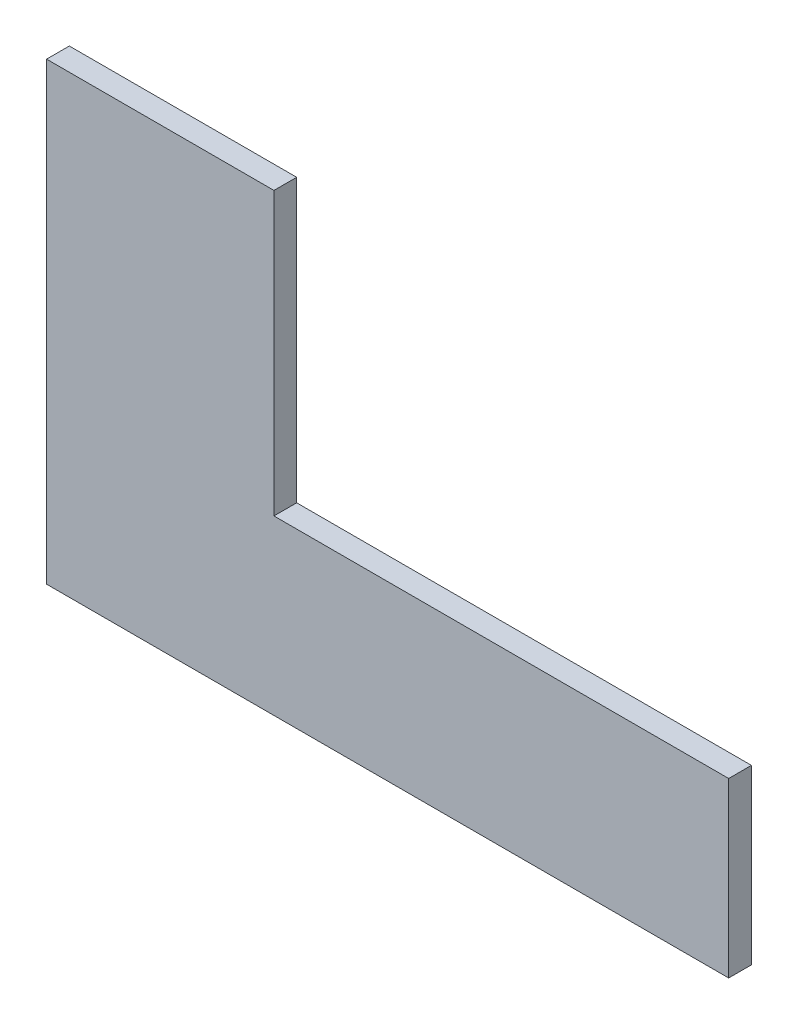
ISO-10303-21;
HEADER;
FILE_DESCRIPTION(('STEP AP214'),'2;1');
FILE_NAME('part.step','',(''),(''),'','','');
FILE_SCHEMA(('AUTOMOTIVE_DESIGN { 1 0 10303 214 1 1 1 1 }'));
ENDSEC;
DATA;
#1=APPLICATION_CONTEXT('core data for automotive mechanical design processes');
#2=APPLICATION_PROTOCOL_DEFINITION('international standard','automotive_design',2000,#1);
#3=PRODUCT_CONTEXT('',#1,'mechanical');
#4=PRODUCT('Part','Part','',(#3));
#5=PRODUCT_RELATED_PRODUCT_CATEGORY('part','',(#4));
#6=PRODUCT_DEFINITION_FORMATION('','',#4);
#7=PRODUCT_DEFINITION_CONTEXT('part definition',#1,'design');
#8=PRODUCT_DEFINITION('design','',#6,#7);
#9=PRODUCT_DEFINITION_SHAPE('','',#8);
#10=(LENGTH_UNIT() NAMED_UNIT(*) SI_UNIT(.MILLI.,.METRE.));
#11=(NAMED_UNIT(*) PLANE_ANGLE_UNIT() SI_UNIT($,.RADIAN.));
#12=(NAMED_UNIT(*) SI_UNIT($,.STERADIAN.) SOLID_ANGLE_UNIT());
#13=UNCERTAINTY_MEASURE_WITH_UNIT(LENGTH_MEASURE(1.E-05),#10,'distance_accuracy_value','');
#14=(GEOMETRIC_REPRESENTATION_CONTEXT(3) GLOBAL_UNCERTAINTY_ASSIGNED_CONTEXT((#13)) GLOBAL_UNIT_ASSIGNED_CONTEXT((#10,
#11,#12)) REPRESENTATION_CONTEXT('',''));
#15=CARTESIAN_POINT('',(0.,0.,0.));
#16=DIRECTION('',(0.,0.,1.));
#17=DIRECTION('',(1.,0.,0.));
#18=AXIS2_PLACEMENT_3D('',#15,#16,#17);
#19=CARTESIAN_POINT('',(-86.8933066390796,-49.5409866344727,5.));
#20=DIRECTION('',(1.,0.,0.));
#21=DIRECTION('',(0.,1.,0.));
#22=AXIS2_PLACEMENT_3D('',#19,#20,#21);
#23=PLANE('',#22);
#24=DIRECTION('',(0.,-1.,0.));
#25=VECTOR('',#24,1.);
#26=CARTESIAN_POINT('',(-86.8933066390796,-49.5409866344727,0.));
#27=LINE('',#26,#25);
#28=CARTESIAN_POINT('',(-86.8933066390796,50.4590133655273,0.));
#29=VERTEX_POINT('',#28);
#30=CARTESIAN_POINT('',(-86.8933066390796,-49.5409866344727,0.));
#31=VERTEX_POINT('',#30);
#32=EDGE_CURVE('E132',#29,#31,#27,.T.);
#33=ORIENTED_EDGE('',*,*,#32,.T.);
#34=DIRECTION('',(0.,0.,-1.));
#35=VECTOR('',#34,1.);
#36=CARTESIAN_POINT('',(-86.8933066390796,-49.5409866344727,5.));
#37=LINE('',#36,#35);
#38=CARTESIAN_POINT('',(-86.8933066390796,-49.5409866344727,5.));
#39=VERTEX_POINT('',#38);
#40=EDGE_CURVE('E11',#39,#31,#37,.T.);
#41=ORIENTED_EDGE('',*,*,#40,.F.);
#42=DIRECTION('',(0.,-1.,0.));
#43=VECTOR('',#42,1.);
#44=CARTESIAN_POINT('',(-86.8933066390796,-49.5409866344727,5.));
#45=LINE('',#44,#43);
#46=CARTESIAN_POINT('',(-86.8933066390796,50.4590133655273,5.));
#47=VERTEX_POINT('',#46);
#48=EDGE_CURVE('E148',#47,#39,#45,.T.);
#49=ORIENTED_EDGE('',*,*,#48,.F.);
#50=DIRECTION('',(0.,0.,-1.));
#51=VECTOR('',#50,1.);
#52=CARTESIAN_POINT('',(-86.8933066390796,50.4590133655273,5.));
#53=LINE('',#52,#51);
#54=EDGE_CURVE('E128',#47,#29,#53,.T.);
#55=ORIENTED_EDGE('',*,*,#54,.T.);
#56=EDGE_LOOP('',(#33,#41,#49,#55));
#57=FACE_BOUND('',#56,.T.);
#58=ADVANCED_FACE('F43',(#57),#23,.F.);
#59=CARTESIAN_POINT('',(63.1066933609204,-49.5409866344727,5.));
#60=DIRECTION('',(0.,1.,0.));
#61=DIRECTION('',(0.,0.,1.));
#62=AXIS2_PLACEMENT_3D('',#59,#60,#61);
#63=PLANE('',#62);
#64=DIRECTION('',(1.,0.,0.));
#65=VECTOR('',#64,1.);
#66=CARTESIAN_POINT('',(63.1066933609204,-49.5409866344727,0.));
#67=LINE('',#66,#65);
#68=CARTESIAN_POINT('',(63.1066933609204,-49.5409866344727,0.));
#69=VERTEX_POINT('',#68);
#70=EDGE_CURVE('E136',#31,#69,#67,.T.);
#71=ORIENTED_EDGE('',*,*,#70,.T.);
#72=DIRECTION('',(0.,0.,-1.));
#73=VECTOR('',#72,1.);
#74=CARTESIAN_POINT('',(63.1066933609204,-49.5409866344727,5.));
#75=LINE('',#74,#73);
#76=CARTESIAN_POINT('',(63.1066933609204,-49.5409866344727,5.));
#77=VERTEX_POINT('',#76);
#78=EDGE_CURVE('E52',#77,#69,#75,.T.);
#79=ORIENTED_EDGE('',*,*,#78,.F.);
#80=DIRECTION('',(1.,0.,0.));
#81=VECTOR('',#80,1.);
#82=CARTESIAN_POINT('',(63.1066933609204,-49.5409866344727,5.));
#83=LINE('',#82,#81);
#84=EDGE_CURVE('E97',#39,#77,#83,.T.);
#85=ORIENTED_EDGE('',*,*,#84,.F.);
#86=ORIENTED_EDGE('',*,*,#40,.T.);
#87=EDGE_LOOP('',(#71,#79,#85,#86));
#88=FACE_BOUND('',#87,.T.);
#89=ADVANCED_FACE('F176',(#88),#63,.F.);
#90=CARTESIAN_POINT('',(63.1066933609204,-11.5409866344727,5.));
#91=DIRECTION('',(-1.,0.,0.));
#92=DIRECTION('',(0.,0.,1.));
#93=AXIS2_PLACEMENT_3D('',#90,#91,#92);
#94=PLANE('',#93);
#95=DIRECTION('',(0.,1.,0.));
#96=VECTOR('',#95,1.);
#97=CARTESIAN_POINT('',(63.1066933609204,-11.5409866344727,0.));
#98=LINE('',#97,#96);
#99=CARTESIAN_POINT('',(63.1066933609204,-11.5409866344727,0.));
#100=VERTEX_POINT('',#99);
#101=EDGE_CURVE('E139',#69,#100,#98,.T.);
#102=ORIENTED_EDGE('',*,*,#101,.T.);
#103=DIRECTION('',(0.,0.,-1.));
#104=VECTOR('',#103,1.);
#105=CARTESIAN_POINT('',(63.1066933609204,-11.5409866344727,5.));
#106=LINE('',#105,#104);
#107=CARTESIAN_POINT('',(63.1066933609204,-11.5409866344727,5.));
#108=VERTEX_POINT('',#107);
#109=EDGE_CURVE('E121',#108,#100,#106,.T.);
#110=ORIENTED_EDGE('',*,*,#109,.F.);
#111=DIRECTION('',(0.,1.,0.));
#112=VECTOR('',#111,1.);
#113=CARTESIAN_POINT('',(63.1066933609204,-11.5409866344727,5.));
#114=LINE('',#113,#112);
#115=EDGE_CURVE('E110',#77,#108,#114,.T.);
#116=ORIENTED_EDGE('',*,*,#115,.F.);
#117=ORIENTED_EDGE('',*,*,#78,.T.);
#118=EDGE_LOOP('',(#102,#110,#116,#117));
#119=FACE_BOUND('',#118,.T.);
#120=ADVANCED_FACE('F158',(#119),#94,.F.);
#121=CARTESIAN_POINT('',(-36.8933066390796,-11.5409866344727,5.));
#122=DIRECTION('',(0.,-1.,0.));
#123=DIRECTION('',(0.,0.,-1.));
#124=AXIS2_PLACEMENT_3D('',#121,#122,#123);
#125=PLANE('',#124);
#126=DIRECTION('',(-1.,0.,0.));
#127=VECTOR('',#126,1.);
#128=CARTESIAN_POINT('',(-36.8933066390796,-11.5409866344727,0.));
#129=LINE('',#128,#127);
#130=CARTESIAN_POINT('',(-36.8933066390796,-11.5409866344727,0.));
#131=VERTEX_POINT('',#130);
#132=EDGE_CURVE('E119',#100,#131,#129,.T.);
#133=ORIENTED_EDGE('',*,*,#132,.T.);
#134=DIRECTION('',(0.,0.,-1.));
#135=VECTOR('',#134,1.);
#136=CARTESIAN_POINT('',(-36.8933066390796,-11.5409866344727,5.));
#137=LINE('',#136,#135);
#138=CARTESIAN_POINT('',(-36.8933066390796,-11.5409866344727,5.));
#139=VERTEX_POINT('',#138);
#140=EDGE_CURVE('E116',#139,#131,#137,.T.);
#141=ORIENTED_EDGE('',*,*,#140,.F.);
#142=DIRECTION('',(-1.,0.,0.));
#143=VECTOR('',#142,1.);
#144=CARTESIAN_POINT('',(-36.8933066390796,-11.5409866344727,5.));
#145=LINE('',#144,#143);
#146=EDGE_CURVE('E104',#108,#139,#145,.T.);
#147=ORIENTED_EDGE('',*,*,#146,.F.);
#148=ORIENTED_EDGE('',*,*,#109,.T.);
#149=EDGE_LOOP('',(#133,#141,#147,#148));
#150=FACE_BOUND('',#149,.T.);
#151=ADVANCED_FACE('F117',(#150),#125,.F.);
#152=CARTESIAN_POINT('',(-36.8933066390796,50.4590133655273,5.));
#153=DIRECTION('',(-1.,0.,0.));
#154=DIRECTION('',(0.,0.,1.));
#155=AXIS2_PLACEMENT_3D('',#152,#153,#154);
#156=PLANE('',#155);
#157=DIRECTION('',(0.,1.,0.));
#158=VECTOR('',#157,1.);
#159=CARTESIAN_POINT('',(-36.8933066390796,50.4590133655273,0.));
#160=LINE('',#159,#158);
#161=CARTESIAN_POINT('',(-36.8933066390796,50.4590133655273,0.));
#162=VERTEX_POINT('',#161);
#163=EDGE_CURVE('E83',#131,#162,#160,.T.);
#164=ORIENTED_EDGE('',*,*,#163,.T.);
#165=DIRECTION('',(0.,0.,-1.));
#166=VECTOR('',#165,1.);
#167=CARTESIAN_POINT('',(-36.8933066390796,50.4590133655273,5.));
#168=LINE('',#167,#166);
#169=CARTESIAN_POINT('',(-36.8933066390796,50.4590133655273,5.));
#170=VERTEX_POINT('',#169);
#171=EDGE_CURVE('E122',#170,#162,#168,.T.);
#172=ORIENTED_EDGE('',*,*,#171,.F.);
#173=DIRECTION('',(0.,1.,0.));
#174=VECTOR('',#173,1.);
#175=CARTESIAN_POINT('',(-36.8933066390796,50.4590133655273,5.));
#176=LINE('',#175,#174);
#177=EDGE_CURVE('E108',#139,#170,#176,.T.);
#178=ORIENTED_EDGE('',*,*,#177,.F.);
#179=ORIENTED_EDGE('',*,*,#140,.T.);
#180=EDGE_LOOP('',(#164,#172,#178,#179));
#181=FACE_BOUND('',#180,.T.);
#182=ADVANCED_FACE('F124',(#181),#156,.F.);
#183=CARTESIAN_POINT('',(-86.8933066390796,50.4590133655273,5.));
#184=DIRECTION('',(0.,-1.,0.));
#185=DIRECTION('',(1.,0.,0.));
#186=AXIS2_PLACEMENT_3D('',#183,#184,#185);
#187=PLANE('',#186);
#188=DIRECTION('',(-1.,0.,0.));
#189=VECTOR('',#188,1.);
#190=CARTESIAN_POINT('',(-86.8933066390796,50.4590133655273,0.));
#191=LINE('',#190,#189);
#192=EDGE_CURVE('E89',#162,#29,#191,.T.);
#193=ORIENTED_EDGE('',*,*,#192,.T.);
#194=ORIENTED_EDGE('',*,*,#54,.F.);
#195=DIRECTION('',(-1.,0.,0.));
#196=VECTOR('',#195,1.);
#197=CARTESIAN_POINT('',(-86.8933066390796,50.4590133655273,5.));
#198=LINE('',#197,#196);
#199=EDGE_CURVE('E60',#170,#47,#198,.T.);
#200=ORIENTED_EDGE('',*,*,#199,.F.);
#201=ORIENTED_EDGE('',*,*,#171,.T.);
#202=EDGE_LOOP('',(#193,#194,#200,#201));
#203=FACE_BOUND('',#202,.T.);
#204=ADVANCED_FACE('F165',(#203),#187,.F.);
#205=CARTESIAN_POINT('',(0.,0.,5.));
#206=DIRECTION('',(0.,0.,-1.));
#207=DIRECTION('',(-1.,0.,0.));
#208=AXIS2_PLACEMENT_3D('',#205,#206,#207);
#209=PLANE('',#208);
#210=ORIENTED_EDGE('',*,*,#48,.T.);
#211=ORIENTED_EDGE('',*,*,#84,.T.);
#212=ORIENTED_EDGE('',*,*,#115,.T.);
#213=ORIENTED_EDGE('',*,*,#146,.T.);
#214=ORIENTED_EDGE('',*,*,#177,.T.);
#215=ORIENTED_EDGE('',*,*,#199,.T.);
#216=EDGE_LOOP('',(#210,#211,#212,#213,#214,#215));
#217=FACE_BOUND('',#216,.T.);
#218=ADVANCED_FACE('F106',(#217),#209,.F.);
#219=CARTESIAN_POINT('',(0.,0.,0.));
#220=DIRECTION('',(0.,0.,-1.));
#221=DIRECTION('',(-1.,0.,0.));
#222=AXIS2_PLACEMENT_3D('',#219,#220,#221);
#223=PLANE('',#222);
#224=ORIENTED_EDGE('',*,*,#32,.F.);
#225=ORIENTED_EDGE('',*,*,#192,.F.);
#226=ORIENTED_EDGE('',*,*,#163,.F.);
#227=ORIENTED_EDGE('',*,*,#132,.F.);
#228=ORIENTED_EDGE('',*,*,#101,.F.);
#229=ORIENTED_EDGE('',*,*,#70,.F.);
#230=EDGE_LOOP('',(#224,#225,#226,#227,#228,#229));
#231=FACE_BOUND('',#230,.T.);
#232=ADVANCED_FACE('F161',(#231),#223,.T.);
#233=CLOSED_SHELL('',(#58,#89,#120,#151,#182,#204,#218,#232));
#234=MANIFOLD_SOLID_BREP('B2',#233);
#235=ADVANCED_BREP_SHAPE_REPRESENTATION('',(#18,#234),#14);
#236=SHAPE_DEFINITION_REPRESENTATION(#9,#235);
ENDSEC;
END-ISO-10303-21;
